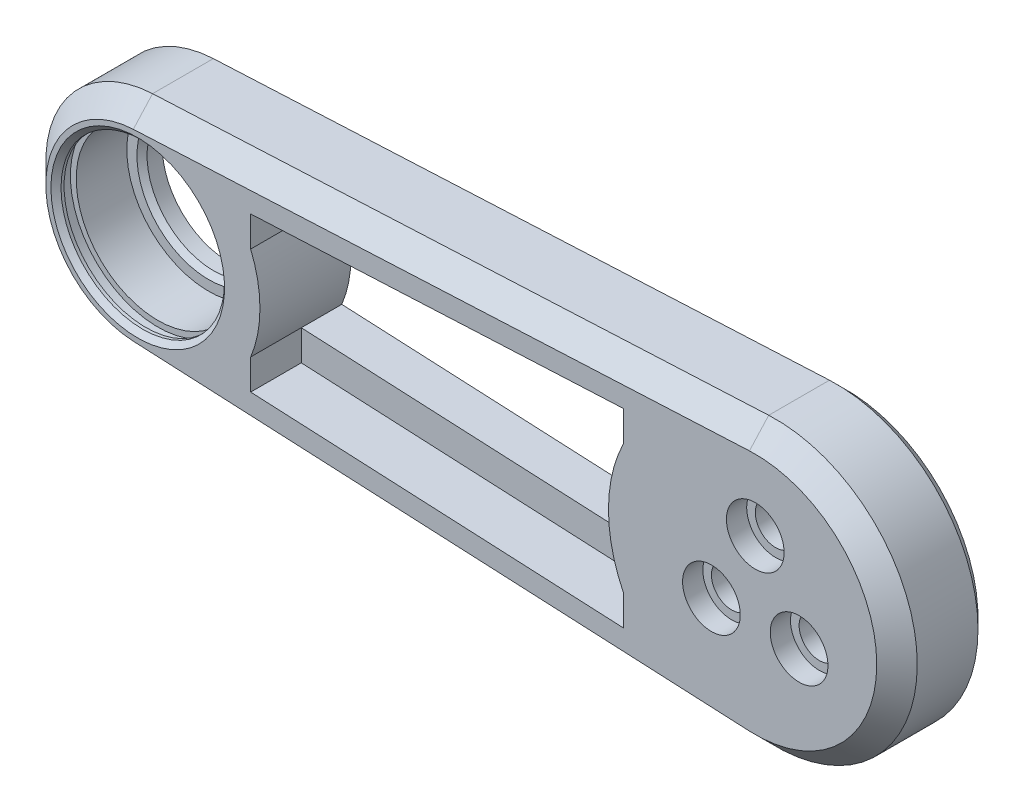
ISO-10303-21;
HEADER;
FILE_DESCRIPTION(('STEP AP214'),'2;1');
FILE_NAME('part.step','',(''),(''),'','','');
FILE_SCHEMA(('AUTOMOTIVE_DESIGN { 1 0 10303 214 1 1 1 1 }'));
ENDSEC;
DATA;
#1=APPLICATION_CONTEXT('core data for automotive mechanical design processes');
#2=APPLICATION_PROTOCOL_DEFINITION('international standard','automotive_design',2000,#1);
#3=PRODUCT_CONTEXT('',#1,'mechanical');
#4=PRODUCT('Part','Part','',(#3));
#5=PRODUCT_RELATED_PRODUCT_CATEGORY('part','',(#4));
#6=PRODUCT_DEFINITION_FORMATION('','',#4);
#7=PRODUCT_DEFINITION_CONTEXT('part definition',#1,'design');
#8=PRODUCT_DEFINITION('design','',#6,#7);
#9=PRODUCT_DEFINITION_SHAPE('','',#8);
#10=(LENGTH_UNIT() NAMED_UNIT(*) SI_UNIT(.MILLI.,.METRE.));
#11=(NAMED_UNIT(*) PLANE_ANGLE_UNIT() SI_UNIT($,.RADIAN.));
#12=(NAMED_UNIT(*) SI_UNIT($,.STERADIAN.) SOLID_ANGLE_UNIT());
#13=UNCERTAINTY_MEASURE_WITH_UNIT(LENGTH_MEASURE(1.E-05),#10,'distance_accuracy_value','');
#14=(GEOMETRIC_REPRESENTATION_CONTEXT(3) GLOBAL_UNCERTAINTY_ASSIGNED_CONTEXT((#13)) GLOBAL_UNIT_ASSIGNED_CONTEXT((#10,
#11,#12)) REPRESENTATION_CONTEXT('',''));
#15=CARTESIAN_POINT('',(0.,0.,0.));
#16=DIRECTION('',(0.,0.,1.));
#17=DIRECTION('',(1.,0.,0.));
#18=AXIS2_PLACEMENT_3D('',#15,#16,#17);
#19=CARTESIAN_POINT('',(56.6698729810778,-2.5,-0.656854249492387));
#20=DIRECTION('',(0.,0.,1.));
#21=DIRECTION('',(-1.,0.,0.));
#22=AXIS2_PLACEMENT_3D('',#19,#20,#21);
#23=CYLINDRICAL_SURFACE('',#22,2.);
#24=CARTESIAN_POINT('',(56.6698729810778,-2.5,4.));
#25=DIRECTION('',(0.,0.,1.));
#26=DIRECTION('',(1.,0.,0.));
#27=AXIS2_PLACEMENT_3D('',#24,#25,#26);
#28=CIRCLE('',#27,2.);
#29=CARTESIAN_POINT('',(58.6698729810778,-2.5,4.));
#30=VERTEX_POINT('',#29);
#31=EDGE_CURVE('E196',#30,#30,#28,.F.);
#32=ORIENTED_EDGE('',*,*,#31,.T.);
#33=EDGE_LOOP('',(#32));
#34=FACE_BOUND('',#33,.T.);
#35=CARTESIAN_POINT('',(56.6698729810778,-2.5,6.));
#36=DIRECTION('',(0.,0.,-1.));
#37=DIRECTION('',(-1.,0.,0.));
#38=AXIS2_PLACEMENT_3D('',#35,#36,#37);
#39=CIRCLE('',#38,2.);
#40=CARTESIAN_POINT('',(54.6698729810778,-2.5,6.));
#41=VERTEX_POINT('',#40);
#42=EDGE_CURVE('E944',#41,#41,#39,.T.);
#43=ORIENTED_EDGE('',*,*,#42,.F.);
#44=EDGE_LOOP('',(#43));
#45=FACE_BOUND('',#44,.T.);
#46=ADVANCED_FACE('F50',(#34,#45),#23,.F.);
#47=CARTESIAN_POINT('',(65.3301270189222,-2.5,-0.656854249492387));
#48=DIRECTION('',(0.,0.,1.));
#49=DIRECTION('',(-1.,0.,0.));
#50=AXIS2_PLACEMENT_3D('',#47,#48,#49);
#51=CYLINDRICAL_SURFACE('',#50,2.);
#52=CARTESIAN_POINT('',(65.3301270189222,-2.5,4.));
#53=DIRECTION('',(0.,0.,1.));
#54=DIRECTION('',(1.,0.,0.));
#55=AXIS2_PLACEMENT_3D('',#52,#53,#54);
#56=CIRCLE('',#55,2.);
#57=CARTESIAN_POINT('',(67.3301270189222,-2.5,4.));
#58=VERTEX_POINT('',#57);
#59=EDGE_CURVE('E932',#58,#58,#56,.F.);
#60=ORIENTED_EDGE('',*,*,#59,.T.);
#61=EDGE_LOOP('',(#60));
#62=FACE_BOUND('',#61,.T.);
#63=CARTESIAN_POINT('',(65.3301270189222,-2.5,6.));
#64=DIRECTION('',(0.,0.,-1.));
#65=DIRECTION('',(-1.,0.,0.));
#66=AXIS2_PLACEMENT_3D('',#63,#64,#65);
#67=CIRCLE('',#66,2.00000000000001);
#68=CARTESIAN_POINT('',(63.3301270189222,-2.5,6.));
#69=VERTEX_POINT('',#68);
#70=EDGE_CURVE('E937',#69,#69,#67,.T.);
#71=ORIENTED_EDGE('',*,*,#70,.F.);
#72=EDGE_LOOP('',(#71));
#73=FACE_BOUND('',#72,.T.);
#74=ADVANCED_FACE('F402',(#62,#73),#51,.F.);
#75=CARTESIAN_POINT('',(61.,5.,-0.656854249492387));
#76=DIRECTION('',(0.,0.,1.));
#77=DIRECTION('',(-1.,0.,0.));
#78=AXIS2_PLACEMENT_3D('',#75,#76,#77);
#79=CYLINDRICAL_SURFACE('',#78,2.);
#80=CARTESIAN_POINT('',(61.,5.,4.));
#81=DIRECTION('',(0.,0.,1.));
#82=DIRECTION('',(1.,0.,0.));
#83=AXIS2_PLACEMENT_3D('',#80,#81,#82);
#84=CIRCLE('',#83,2.);
#85=CARTESIAN_POINT('',(63.,5.,4.));
#86=VERTEX_POINT('',#85);
#87=EDGE_CURVE('E194',#86,#86,#84,.F.);
#88=ORIENTED_EDGE('',*,*,#87,.T.);
#89=EDGE_LOOP('',(#88));
#90=FACE_BOUND('',#89,.T.);
#91=CARTESIAN_POINT('',(61.,5.,6.));
#92=DIRECTION('',(0.,0.,-1.));
#93=DIRECTION('',(-1.,0.,0.));
#94=AXIS2_PLACEMENT_3D('',#91,#92,#93);
#95=CIRCLE('',#94,2.);
#96=CARTESIAN_POINT('',(59.,5.,6.));
#97=VERTEX_POINT('',#96);
#98=EDGE_CURVE('E931',#97,#97,#95,.T.);
#99=ORIENTED_EDGE('',*,*,#98,.F.);
#100=EDGE_LOOP('',(#99));
#101=FACE_BOUND('',#100,.T.);
#102=ADVANCED_FACE('F410',(#90,#101),#79,.F.);
#103=CARTESIAN_POINT('',(-0.195399590163935,4.07031251873413,46.9725685445366));
#104=DIRECTION('',(-0.0479508196721314,0.998849697848866,0.));
#105=DIRECTION('',(-0.998849697848866,-0.0479508196721314,0.));
#106=AXIS2_PLACEMENT_3D('',#103,#104,#105);
#107=PLANE('',#106);
#108=DIRECTION('',(0.998849697848866,0.0479508196721314,0.));
#109=VECTOR('',#108,1.);
#110=CARTESIAN_POINT('',(-0.195399590163935,4.07031251873413,-0.999999999999999));
#111=LINE('',#110,#109);
#112=CARTESIAN_POINT('',(11.1581431556465,4.61535115869832,-0.999999999999999));
#113=VERTEX_POINT('',#112);
#114=CARTESIAN_POINT('',(47.9805261888024,6.38304799289025,-0.999999999999999));
#115=VERTEX_POINT('',#114);
#116=EDGE_CURVE('E193',#113,#115,#111,.T.);
#117=ORIENTED_EDGE('',*,*,#116,.T.);
#118=DIRECTION('',(0.,0.,-1.));
#119=VECTOR('',#118,1.);
#120=CARTESIAN_POINT('',(47.9805261888024,6.38304799289025,46.9725685445366));
#121=LINE('',#120,#119);
#122=CARTESIAN_POINT('',(47.9805261888024,6.38304799289026,3.));
#123=VERTEX_POINT('',#122);
#124=EDGE_CURVE('E180',#123,#115,#121,.T.);
#125=ORIENTED_EDGE('',*,*,#124,.F.);
#126=DIRECTION('',(-0.998849697848866,-0.0479508196721314,0.));
#127=VECTOR('',#126,1.);
#128=CARTESIAN_POINT('',(-0.195399590163935,4.07031251873413,3.));
#129=LINE('',#128,#127);
#130=CARTESIAN_POINT('',(11.1581431556465,4.61535115869832,3.));
#131=VERTEX_POINT('',#130);
#132=EDGE_CURVE('E237',#123,#131,#129,.T.);
#133=ORIENTED_EDGE('',*,*,#132,.T.);
#134=DIRECTION('',(0.,0.,-1.));
#135=VECTOR('',#134,1.);
#136=CARTESIAN_POINT('',(11.1581431556465,4.61535115869833,46.9725685445366));
#137=LINE('',#136,#135);
#138=EDGE_CURVE('E273',#131,#113,#137,.T.);
#139=ORIENTED_EDGE('',*,*,#138,.T.);
#140=EDGE_LOOP('',(#117,#125,#133,#139));
#141=FACE_BOUND('',#140,.T.);
#142=ADVANCED_FACE('F498',(#141),#107,.F.);
#143=CARTESIAN_POINT('',(-0.195399590163936,-4.07031251873413,46.9725685445366));
#144=DIRECTION('',(-0.0479508196721316,-0.998849697848866,0.));
#145=DIRECTION('',(0.998849697848866,-0.0479508196721316,0.));
#146=AXIS2_PLACEMENT_3D('',#143,#144,#145);
#147=PLANE('',#146);
#148=DIRECTION('',(-0.998849697848866,0.0479508196721316,0.));
#149=VECTOR('',#148,1.);
#150=CARTESIAN_POINT('',(-0.195399590163936,-4.07031251873413,-0.999999999999999));
#151=LINE('',#150,#149);
#152=CARTESIAN_POINT('',(47.9805261888024,-6.38304799289026,-0.999999999999999));
#153=VERTEX_POINT('',#152);
#154=CARTESIAN_POINT('',(11.1581431556465,-4.61535115869833,-0.999999999999999));
#155=VERTEX_POINT('',#154);
#156=EDGE_CURVE('E181',#153,#155,#151,.T.);
#157=ORIENTED_EDGE('',*,*,#156,.T.);
#158=DIRECTION('',(0.,0.,-1.));
#159=VECTOR('',#158,1.);
#160=CARTESIAN_POINT('',(11.1581431556465,-4.61535115869833,46.9725685445366));
#161=LINE('',#160,#159);
#162=CARTESIAN_POINT('',(11.1581431556465,-4.61535115869833,3.));
#163=VERTEX_POINT('',#162);
#164=EDGE_CURVE('E276',#163,#155,#161,.T.);
#165=ORIENTED_EDGE('',*,*,#164,.F.);
#166=DIRECTION('',(0.998849697848866,-0.0479508196721316,0.));
#167=VECTOR('',#166,1.);
#168=CARTESIAN_POINT('',(-0.195399590163936,-4.07031251873413,3.));
#169=LINE('',#168,#167);
#170=CARTESIAN_POINT('',(47.9805261888024,-6.38304799289027,3.));
#171=VERTEX_POINT('',#170);
#172=EDGE_CURVE('E183',#163,#171,#169,.T.);
#173=ORIENTED_EDGE('',*,*,#172,.T.);
#174=DIRECTION('',(0.,0.,-1.));
#175=VECTOR('',#174,1.);
#176=CARTESIAN_POINT('',(47.9805261888024,-6.38304799289027,46.9725685445366));
#177=LINE('',#176,#175);
#178=EDGE_CURVE('E172',#171,#153,#177,.T.);
#179=ORIENTED_EDGE('',*,*,#178,.T.);
#180=EDGE_LOOP('',(#157,#165,#173,#179));
#181=FACE_BOUND('',#180,.T.);
#182=ADVANCED_FACE('F182',(#181),#147,.F.);
#183=CARTESIAN_POINT('',(61.,0.,5.));
#184=DIRECTION('',(0.,0.,-1.));
#185=DIRECTION('',(1.,0.,0.));
#186=AXIS2_PLACEMENT_3D('',#183,#184,#185);
#187=CYLINDRICAL_SURFACE('',#186,9.00000000000001);
#188=CARTESIAN_POINT('',(61.,0.,4.));
#189=DIRECTION('',(0.,0.,1.));
#190=DIRECTION('',(1.,0.,0.));
#191=AXIS2_PLACEMENT_3D('',#188,#189,#190);
#192=CIRCLE('',#191,9.00000000000001);
#193=CARTESIAN_POINT('',(70.,0.,4.));
#194=VERTEX_POINT('',#193);
#195=EDGE_CURVE('E957',#194,#194,#192,.T.);
#196=ORIENTED_EDGE('',*,*,#195,.T.);
#197=EDGE_LOOP('',(#196));
#198=FACE_BOUND('',#197,.T.);
#199=CARTESIAN_POINT('',(61.,0.,-1.));
#200=DIRECTION('',(0.,0.,1.));
#201=DIRECTION('',(1.,0.,0.));
#202=AXIS2_PLACEMENT_3D('',#199,#200,#201);
#203=CIRCLE('',#202,9.00000000000001);
#204=CARTESIAN_POINT('',(70.,0.,-1.));
#205=VERTEX_POINT('',#204);
#206=EDGE_CURVE('E212',#205,#205,#203,.F.);
#207=ORIENTED_EDGE('',*,*,#206,.T.);
#208=EDGE_LOOP('',(#207));
#209=FACE_BOUND('',#208,.T.);
#210=ADVANCED_FACE('F417',(#198,#209),#187,.F.);
#211=CARTESIAN_POINT('',(0.,0.,1.));
#212=DIRECTION('',(0.,0.,-1.));
#213=DIRECTION('',(1.,0.,0.));
#214=AXIS2_PLACEMENT_3D('',#211,#212,#213);
#215=CYLINDRICAL_SURFACE('',#214,6.575);
#216=CARTESIAN_POINT('',(0.,0.,0.500000000000003));
#217=DIRECTION('',(0.,0.,1.));
#218=DIRECTION('',(1.,0.,0.));
#219=AXIS2_PLACEMENT_3D('',#216,#217,#218);
#220=CIRCLE('',#219,6.575);
#221=CARTESIAN_POINT('',(6.575,0.,0.500000000000003));
#222=VERTEX_POINT('',#221);
#223=EDGE_CURVE('E307',#222,#222,#220,.F.);
#224=ORIENTED_EDGE('',*,*,#223,.F.);
#225=EDGE_LOOP('',(#224));
#226=FACE_BOUND('',#225,.T.);
#227=CARTESIAN_POINT('',(0.,0.,-1.));
#228=DIRECTION('',(0.,0.,1.));
#229=DIRECTION('',(1.,0.,0.));
#230=AXIS2_PLACEMENT_3D('',#227,#228,#229);
#231=CIRCLE('',#230,6.575);
#232=CARTESIAN_POINT('',(6.575,0.,-1.));
#233=VERTEX_POINT('',#232);
#234=EDGE_CURVE('E211',#233,#233,#231,.F.);
#235=ORIENTED_EDGE('',*,*,#234,.T.);
#236=EDGE_LOOP('',(#235));
#237=FACE_BOUND('',#236,.T.);
#238=ADVANCED_FACE('F414',(#226,#237),#215,.F.);
#239=CARTESIAN_POINT('',(-0.531055327868853,11.0622604036762,0.));
#240=DIRECTION('',(-0.0339063497536172,0.706293394735065,-0.707106781186549));
#241=DIRECTION('',(-0.998849697848866,-0.0479508196721312,0.));
#242=AXIS2_PLACEMENT_3D('',#239,#240,#241);
#243=PLANE('',#242);
#244=DIRECTION('',(-0.0339063497536173,0.706293394735069,0.707106781186546));
#245=VECTOR('',#244,1.);
#246=CARTESIAN_POINT('',(-0.43515368852459,9.06456100797846,-2.));
#247=LINE('',#246,#245);
#248=CARTESIAN_POINT('',(-0.483104508196722,10.0634107058273,-1.));
#249=VERTEX_POINT('',#248);
#250=CARTESIAN_POINT('',(-0.531055327868852,11.0622604036762,0.));
#251=VERTEX_POINT('',#250);
#252=EDGE_CURVE('E346',#249,#251,#247,.T.);
#253=ORIENTED_EDGE('',*,*,#252,.T.);
#254=DIRECTION('',(0.998849697848866,0.0479508196721312,0.));
#255=VECTOR('',#254,1.);
#256=CARTESIAN_POINT('',(60.3286885245902,13.9838957698841,0.));
#257=LINE('',#256,#255);
#258=CARTESIAN_POINT('',(60.3286885245902,13.9838957698841,0.));
#259=VERTEX_POINT('',#258);
#260=EDGE_CURVE('E339',#251,#259,#257,.T.);
#261=ORIENTED_EDGE('',*,*,#260,.T.);
#262=DIRECTION('',(0.0339063497536167,-0.706293394735069,-0.707106781186546));
#263=VECTOR('',#262,1.);
#264=CARTESIAN_POINT('',(60.3286885245902,13.9838957698841,0.));
#265=LINE('',#264,#263);
#266=CARTESIAN_POINT('',(60.3766393442623,12.9850460720353,-1.));
#267=VERTEX_POINT('',#266);
#268=EDGE_CURVE('E358',#259,#267,#265,.T.);
#269=ORIENTED_EDGE('',*,*,#268,.T.);
#270=DIRECTION('',(0.998849697848866,0.0479508196721312,0.));
#271=VECTOR('',#270,1.);
#272=CARTESIAN_POINT('',(-0.483104508196722,10.0634107058273,-1.));
#273=LINE('',#272,#271);
#274=EDGE_CURVE('E208',#249,#267,#273,.T.);
#275=ORIENTED_EDGE('',*,*,#274,.F.);
#276=EDGE_LOOP('',(#253,#261,#269,#275));
#277=FACE_BOUND('',#276,.T.);
#278=ADVANCED_FACE('F47',(#277),#243,.T.);
#279=CARTESIAN_POINT('',(0.,0.,-2.));
#280=DIRECTION('',(0.,0.,1.));
#281=DIRECTION('',(-1.,0.,0.));
#282=AXIS2_PLACEMENT_3D('',#279,#280,#281);
#283=CONICAL_SURFACE('',#282,9.075,0.785398163397451);
#284=DIRECTION('',(-0.0339063497536173,-0.706293394735069,0.707106781186546));
#285=VECTOR('',#284,1.);
#286=CARTESIAN_POINT('',(-0.43515368852459,-9.06456100797846,-2.));
#287=LINE('',#286,#285);
#288=CARTESIAN_POINT('',(-0.483104508196722,-10.0634107058273,-1.));
#289=VERTEX_POINT('',#288);
#290=CARTESIAN_POINT('',(-0.531055327868852,-11.0622604036762,0.));
#291=VERTEX_POINT('',#290);
#292=EDGE_CURVE('E354',#289,#291,#287,.T.);
#293=ORIENTED_EDGE('',*,*,#292,.T.);
#294=CARTESIAN_POINT('',(0.,0.,0.));
#295=DIRECTION('',(0.,0.,1.));
#296=DIRECTION('',(1.,0.,0.));
#297=AXIS2_PLACEMENT_3D('',#294,#295,#296);
#298=CIRCLE('',#297,11.075);
#299=EDGE_CURVE('E327',#291,#251,#298,.F.);
#300=ORIENTED_EDGE('',*,*,#299,.T.);
#301=ORIENTED_EDGE('',*,*,#252,.F.);
#302=CARTESIAN_POINT('',(0.,0.,-1.));
#303=DIRECTION('',(0.,0.,1.));
#304=DIRECTION('',(1.,0.,0.));
#305=AXIS2_PLACEMENT_3D('',#302,#303,#304);
#306=CIRCLE('',#305,10.075);
#307=EDGE_CURVE('E206',#289,#249,#306,.F.);
#308=ORIENTED_EDGE('',*,*,#307,.F.);
#309=EDGE_LOOP('',(#293,#300,#301,#308));
#310=FACE_BOUND('',#309,.T.);
#311=ADVANCED_FACE('F368',(#310),#283,.T.);
#312=CARTESIAN_POINT('',(61.,0.,-2.));
#313=DIRECTION('',(0.,0.,1.));
#314=DIRECTION('',(-1.,0.,0.));
#315=AXIS2_PLACEMENT_3D('',#312,#313,#314);
#316=CONICAL_SURFACE('',#315,12.,0.785398163397451);
#317=ORIENTED_EDGE('',*,*,#268,.F.);
#318=CARTESIAN_POINT('',(61.,0.,0.));
#319=DIRECTION('',(0.,0.,1.));
#320=DIRECTION('',(1.,0.,0.));
#321=AXIS2_PLACEMENT_3D('',#318,#319,#320);
#322=CIRCLE('',#321,14.);
#323=CARTESIAN_POINT('',(60.3286885245902,-13.9838957698841,0.));
#324=VERTEX_POINT('',#323);
#325=EDGE_CURVE('E331',#259,#324,#322,.F.);
#326=ORIENTED_EDGE('',*,*,#325,.T.);
#327=DIRECTION('',(0.0339063497536167,0.706293394735069,-0.707106781186546));
#328=VECTOR('',#327,1.);
#329=CARTESIAN_POINT('',(60.3286885245902,-13.9838957698842,0.));
#330=LINE('',#329,#328);
#331=CARTESIAN_POINT('',(60.3766393442623,-12.9850460720353,-1.00000000000001));
#332=VERTEX_POINT('',#331);
#333=EDGE_CURVE('E284',#324,#332,#330,.T.);
#334=ORIENTED_EDGE('',*,*,#333,.T.);
#335=CARTESIAN_POINT('',(61.,0.,-1.));
#336=DIRECTION('',(0.,0.,1.));
#337=DIRECTION('',(1.,0.,0.));
#338=AXIS2_PLACEMENT_3D('',#335,#336,#337);
#339=CIRCLE('',#338,13.);
#340=EDGE_CURVE('E204',#267,#332,#339,.F.);
#341=ORIENTED_EDGE('',*,*,#340,.F.);
#342=EDGE_LOOP('',(#317,#326,#334,#341));
#343=FACE_BOUND('',#342,.T.);
#344=ADVANCED_FACE('F383',(#343),#316,.T.);
#345=CARTESIAN_POINT('',(-0.43515368852459,-9.06456100797846,-2.));
#346=DIRECTION('',(0.0339063497536172,0.706293394735065,0.707106781186549));
#347=DIRECTION('',(0.998849697848866,-0.0479508196721312,0.));
#348=AXIS2_PLACEMENT_3D('',#345,#346,#347);
#349=PLANE('',#348);
#350=ORIENTED_EDGE('',*,*,#333,.F.);
#351=DIRECTION('',(-0.998849697848866,0.0479508196721312,0.));
#352=VECTOR('',#351,1.);
#353=CARTESIAN_POINT('',(-0.531055327868853,-11.0622604036762,0.));
#354=LINE('',#353,#352);
#355=EDGE_CURVE('E325',#324,#291,#354,.T.);
#356=ORIENTED_EDGE('',*,*,#355,.T.);
#357=ORIENTED_EDGE('',*,*,#292,.F.);
#358=DIRECTION('',(0.998849697848866,-0.0479508196721312,0.));
#359=VECTOR('',#358,1.);
#360=CARTESIAN_POINT('',(-0.483104508196722,-10.0634107058273,-1.));
#361=LINE('',#360,#359);
#362=EDGE_CURVE('E65',#332,#289,#361,.F.);
#363=ORIENTED_EDGE('',*,*,#362,.F.);
#364=EDGE_LOOP('',(#350,#356,#357,#363));
#365=FACE_BOUND('',#364,.T.);
#366=ADVANCED_FACE('F473',(#365),#349,.F.);
#367=CARTESIAN_POINT('',(0.,0.,46.9725685445366));
#368=DIRECTION('',(0.,0.,-1.));
#369=DIRECTION('',(1.,0.,0.));
#370=AXIS2_PLACEMENT_3D('',#367,#368,#369);
#371=CYLINDRICAL_SURFACE('',#370,12.075);
#372=ORIENTED_EDGE('',*,*,#138,.F.);
#373=CARTESIAN_POINT('',(11.1581431556465,4.61535115869832,8.));
#374=VERTEX_POINT('',#373);
#375=EDGE_CURVE('E278',#374,#131,#137,.T.);
#376=ORIENTED_EDGE('',*,*,#375,.F.);
#377=CARTESIAN_POINT('',(0.,0.,8.));
#378=DIRECTION('',(0.,0.,-1.));
#379=DIRECTION('',(-1.,0.,0.));
#380=AXIS2_PLACEMENT_3D('',#377,#378,#379);
#381=CIRCLE('',#380,12.075);
#382=CARTESIAN_POINT('',(11.1581431556465,-4.61535115869833,8.));
#383=VERTEX_POINT('',#382);
#384=EDGE_CURVE('E275',#383,#374,#381,.F.);
#385=ORIENTED_EDGE('',*,*,#384,.F.);
#386=EDGE_CURVE('E190',#383,#163,#161,.T.);
#387=ORIENTED_EDGE('',*,*,#386,.T.);
#388=ORIENTED_EDGE('',*,*,#164,.T.);
#389=CARTESIAN_POINT('',(0.,0.,-0.999999999999999));
#390=DIRECTION('',(0.,0.,1.));
#391=DIRECTION('',(1.,0.,0.));
#392=AXIS2_PLACEMENT_3D('',#389,#390,#391);
#393=CIRCLE('',#392,12.075);
#394=EDGE_CURVE('E192',#113,#155,#393,.F.);
#395=ORIENTED_EDGE('',*,*,#394,.F.);
#396=EDGE_LOOP('',(#372,#376,#385,#387,#388,#395));
#397=FACE_BOUND('',#396,.T.);
#398=ADVANCED_FACE('F475',(#397),#371,.T.);
#399=CARTESIAN_POINT('',(61.,0.,46.9725685445366));
#400=DIRECTION('',(0.,0.,-1.));
#401=DIRECTION('',(1.,0.,0.));
#402=AXIS2_PLACEMENT_3D('',#399,#400,#401);
#403=CYLINDRICAL_SURFACE('',#402,14.5);
#404=ORIENTED_EDGE('',*,*,#178,.F.);
#405=CARTESIAN_POINT('',(47.9805261888024,-6.38304799289027,8.));
#406=VERTEX_POINT('',#405);
#407=EDGE_CURVE('E186',#406,#171,#177,.T.);
#408=ORIENTED_EDGE('',*,*,#407,.F.);
#409=CARTESIAN_POINT('',(61.,0.,8.));
#410=DIRECTION('',(0.,0.,-1.));
#411=DIRECTION('',(-1.,0.,0.));
#412=AXIS2_PLACEMENT_3D('',#409,#410,#411);
#413=CIRCLE('',#412,14.5);
#414=CARTESIAN_POINT('',(47.9805261888024,6.38304799289026,8.));
#415=VERTEX_POINT('',#414);
#416=EDGE_CURVE('E253',#415,#406,#413,.F.);
#417=ORIENTED_EDGE('',*,*,#416,.F.);
#418=EDGE_CURVE('E282',#415,#123,#121,.T.);
#419=ORIENTED_EDGE('',*,*,#418,.T.);
#420=ORIENTED_EDGE('',*,*,#124,.T.);
#421=CARTESIAN_POINT('',(61.,0.,-0.999999999999999));
#422=DIRECTION('',(0.,0.,1.));
#423=DIRECTION('',(1.,0.,0.));
#424=AXIS2_PLACEMENT_3D('',#421,#422,#423);
#425=CIRCLE('',#424,14.5);
#426=EDGE_CURVE('E11',#153,#115,#425,.F.);
#427=ORIENTED_EDGE('',*,*,#426,.F.);
#428=EDGE_LOOP('',(#404,#408,#417,#419,#420,#427));
#429=FACE_BOUND('',#428,.T.);
#430=ADVANCED_FACE('F171',(#429),#403,.T.);
#431=CARTESIAN_POINT('',(0.,0.,5.));
#432=DIRECTION('',(0.,0.,-1.));
#433=DIRECTION('',(1.,0.,0.));
#434=AXIS2_PLACEMENT_3D('',#431,#432,#433);
#435=CYLINDRICAL_SURFACE('',#434,8.075);
#436=CARTESIAN_POINT('',(0.,0.,7.2));
#437=DIRECTION('',(0.,0.,1.));
#438=DIRECTION('',(1.,0.,0.));
#439=AXIS2_PLACEMENT_3D('',#436,#437,#438);
#440=CIRCLE('',#439,8.075);
#441=CARTESIAN_POINT('',(8.075,0.,7.2));
#442=VERTEX_POINT('',#441);
#443=EDGE_CURVE('E226',#442,#442,#440,.T.);
#444=ORIENTED_EDGE('',*,*,#443,.F.);
#445=EDGE_LOOP('',(#444));
#446=FACE_BOUND('',#445,.T.);
#447=CARTESIAN_POINT('',(0.,0.,7.5));
#448=DIRECTION('',(0.,0.,-1.));
#449=DIRECTION('',(-1.,0.,0.));
#450=AXIS2_PLACEMENT_3D('',#447,#448,#449);
#451=CIRCLE('',#450,8.075);
#452=CARTESIAN_POINT('',(-8.075,0.,7.5));
#453=VERTEX_POINT('',#452);
#454=EDGE_CURVE('E302',#453,#453,#451,.T.);
#455=ORIENTED_EDGE('',*,*,#454,.F.);
#456=EDGE_LOOP('',(#455));
#457=FACE_BOUND('',#456,.T.);
#458=ADVANCED_FACE('F434',(#446,#457),#435,.F.);
#459=CARTESIAN_POINT('',(0.,0.,6.));
#460=DIRECTION('',(0.,0.,1.));
#461=DIRECTION('',(1.,0.,0.));
#462=AXIS2_PLACEMENT_3D('',#459,#460,#461);
#463=CIRCLE('',#462,8.075);
#464=CARTESIAN_POINT('',(8.075,0.,6.));
#465=VERTEX_POINT('',#464);
#466=EDGE_CURVE('E224',#465,#465,#463,.T.);
#467=ORIENTED_EDGE('',*,*,#466,.T.);
#468=EDGE_LOOP('',(#467));
#469=FACE_BOUND('',#468,.T.);
#470=CARTESIAN_POINT('',(0.,0.,1.));
#471=DIRECTION('',(0.,0.,1.));
#472=DIRECTION('',(1.,0.,0.));
#473=AXIS2_PLACEMENT_3D('',#470,#471,#472);
#474=CIRCLE('',#473,8.075);
#475=CARTESIAN_POINT('',(8.075,0.,1.));
#476=VERTEX_POINT('',#475);
#477=EDGE_CURVE('E288',#476,#476,#474,.F.);
#478=ORIENTED_EDGE('',*,*,#477,.T.);
#479=EDGE_LOOP('',(#478));
#480=FACE_BOUND('',#479,.T.);
#481=ADVANCED_FACE('F431',(#469,#480),#435,.F.);
#482=CARTESIAN_POINT('',(-0.531055327868853,-11.0622604036762,5.));
#483=DIRECTION('',(-0.0479508196721312,-0.998849697848866,0.));
#484=DIRECTION('',(0.998849697848866,-0.0479508196721312,0.));
#485=AXIS2_PLACEMENT_3D('',#482,#483,#484);
#486=PLANE('',#485);
#487=DIRECTION('',(0.,0.,-1.));
#488=VECTOR('',#487,1.);
#489=CARTESIAN_POINT('',(-0.531055327868852,-11.0622604036762,5.));
#490=LINE('',#489,#488);
#491=CARTESIAN_POINT('',(-0.531055327868852,-11.0622604036762,6.));
#492=VERTEX_POINT('',#491);
#493=EDGE_CURVE('E287',#492,#291,#490,.T.);
#494=ORIENTED_EDGE('',*,*,#493,.T.);
#495=ORIENTED_EDGE('',*,*,#355,.F.);
#496=DIRECTION('',(0.,0.,-1.));
#497=VECTOR('',#496,1.);
#498=CARTESIAN_POINT('',(60.3286885245902,-13.9838957698841,5.));
#499=LINE('',#498,#497);
#500=CARTESIAN_POINT('',(60.3286885245902,-13.9838957698841,6.));
#501=VERTEX_POINT('',#500);
#502=EDGE_CURVE('E291',#501,#324,#499,.T.);
#503=ORIENTED_EDGE('',*,*,#502,.F.);
#504=DIRECTION('',(0.998849697848866,-0.0479508196721312,0.));
#505=VECTOR('',#504,1.);
#506=CARTESIAN_POINT('',(-0.531055327868853,-11.0622604036762,6.));
#507=LINE('',#506,#505);
#508=EDGE_CURVE('E324',#492,#501,#507,.T.);
#509=ORIENTED_EDGE('',*,*,#508,.F.);
#510=EDGE_LOOP('',(#494,#495,#503,#509));
#511=FACE_BOUND('',#510,.T.);
#512=ADVANCED_FACE('F432',(#511),#486,.T.);
#513=CARTESIAN_POINT('',(0.,0.,5.));
#514=DIRECTION('',(0.,0.,-1.));
#515=DIRECTION('',(1.,0.,0.));
#516=AXIS2_PLACEMENT_3D('',#513,#514,#515);
#517=CYLINDRICAL_SURFACE('',#516,11.075);
#518=DIRECTION('',(0.,0.,-1.));
#519=VECTOR('',#518,1.);
#520=CARTESIAN_POINT('',(-0.531055327868852,11.0622604036762,5.));
#521=LINE('',#520,#519);
#522=CARTESIAN_POINT('',(-0.531055327868852,11.0622604036762,6.));
#523=VERTEX_POINT('',#522);
#524=EDGE_CURVE('E289',#523,#251,#521,.T.);
#525=ORIENTED_EDGE('',*,*,#524,.T.);
#526=ORIENTED_EDGE('',*,*,#299,.F.);
#527=ORIENTED_EDGE('',*,*,#493,.F.);
#528=CARTESIAN_POINT('',(0.,0.,6.));
#529=DIRECTION('',(0.,0.,-1.));
#530=DIRECTION('',(-1.,0.,0.));
#531=AXIS2_PLACEMENT_3D('',#528,#529,#530);
#532=CIRCLE('',#531,11.075);
#533=EDGE_CURVE('E332',#523,#492,#532,.F.);
#534=ORIENTED_EDGE('',*,*,#533,.F.);
#535=EDGE_LOOP('',(#525,#526,#527,#534));
#536=FACE_BOUND('',#535,.T.);
#537=ADVANCED_FACE('F440',(#536),#517,.T.);
#538=CARTESIAN_POINT('',(-0.531055327868853,11.0622604036762,5.));
#539=DIRECTION('',(0.0479508196721312,-0.998849697848866,0.));
#540=DIRECTION('',(0.998849697848866,0.0479508196721312,0.));
#541=AXIS2_PLACEMENT_3D('',#538,#539,#540);
#542=PLANE('',#541);
#543=DIRECTION('',(0.,0.,-1.));
#544=VECTOR('',#543,1.);
#545=CARTESIAN_POINT('',(60.3286885245902,13.9838957698841,5.));
#546=LINE('',#545,#544);
#547=CARTESIAN_POINT('',(60.3286885245902,13.9838957698841,6.));
#548=VERTEX_POINT('',#547);
#549=EDGE_CURVE('E292',#548,#259,#546,.T.);
#550=ORIENTED_EDGE('',*,*,#549,.T.);
#551=ORIENTED_EDGE('',*,*,#260,.F.);
#552=ORIENTED_EDGE('',*,*,#524,.F.);
#553=DIRECTION('',(-0.998849697848866,-0.0479508196721312,0.));
#554=VECTOR('',#553,1.);
#555=CARTESIAN_POINT('',(-0.531055327868852,11.0622604036762,6.));
#556=LINE('',#555,#554);
#557=EDGE_CURVE('E54',#548,#523,#556,.T.);
#558=ORIENTED_EDGE('',*,*,#557,.F.);
#559=EDGE_LOOP('',(#550,#551,#552,#558));
#560=FACE_BOUND('',#559,.T.);
#561=ADVANCED_FACE('F373',(#560),#542,.F.);
#562=CARTESIAN_POINT('',(61.,0.,5.));
#563=DIRECTION('',(0.,0.,-1.));
#564=DIRECTION('',(1.,0.,0.));
#565=AXIS2_PLACEMENT_3D('',#562,#563,#564);
#566=CYLINDRICAL_SURFACE('',#565,14.);
#567=ORIENTED_EDGE('',*,*,#502,.T.);
#568=ORIENTED_EDGE('',*,*,#325,.F.);
#569=ORIENTED_EDGE('',*,*,#549,.F.);
#570=CARTESIAN_POINT('',(61.,0.,6.));
#571=DIRECTION('',(0.,0.,-1.));
#572=DIRECTION('',(-1.,0.,0.));
#573=AXIS2_PLACEMENT_3D('',#570,#571,#572);
#574=CIRCLE('',#573,14.);
#575=EDGE_CURVE('E340',#501,#548,#574,.F.);
#576=ORIENTED_EDGE('',*,*,#575,.F.);
#577=EDGE_LOOP('',(#567,#568,#569,#576));
#578=FACE_BOUND('',#577,.T.);
#579=ADVANCED_FACE('F379',(#578),#566,.T.);
#580=CARTESIAN_POINT('',(0.,0.,8.));
#581=DIRECTION('',(0.,0.,1.));
#582=DIRECTION('',(-1.,0.,0.));
#583=AXIS2_PLACEMENT_3D('',#580,#581,#582);
#584=PLANE('',#583);
#585=CARTESIAN_POINT('',(61.,5.,8.));
#586=DIRECTION('',(0.,0.,-1.));
#587=DIRECTION('',(-1.,0.,0.));
#588=AXIS2_PLACEMENT_3D('',#585,#586,#587);
#589=CIRCLE('',#588,2.85);
#590=CARTESIAN_POINT('',(58.15,5.,8.));
#591=VERTEX_POINT('',#590);
#592=EDGE_CURVE('E929',#591,#591,#589,.T.);
#593=ORIENTED_EDGE('',*,*,#592,.T.);
#594=EDGE_LOOP('',(#593));
#595=FACE_BOUND('',#594,.T.);
#596=CARTESIAN_POINT('',(65.3301270189222,-2.5,8.));
#597=DIRECTION('',(0.,0.,-1.));
#598=DIRECTION('',(-1.,0.,0.));
#599=AXIS2_PLACEMENT_3D('',#596,#597,#598);
#600=CIRCLE('',#599,2.85);
#601=CARTESIAN_POINT('',(62.4801270189222,-2.5,8.));
#602=VERTEX_POINT('',#601);
#603=EDGE_CURVE('E936',#602,#602,#600,.T.);
#604=ORIENTED_EDGE('',*,*,#603,.T.);
#605=EDGE_LOOP('',(#604));
#606=FACE_BOUND('',#605,.T.);
#607=CARTESIAN_POINT('',(56.6698729810778,-2.5,8.));
#608=DIRECTION('',(0.,0.,-1.));
#609=DIRECTION('',(-1.,0.,0.));
#610=AXIS2_PLACEMENT_3D('',#607,#608,#609);
#611=CIRCLE('',#610,2.85);
#612=CARTESIAN_POINT('',(53.8198729810778,-2.5,8.));
#613=VERTEX_POINT('',#612);
#614=EDGE_CURVE('E948',#613,#613,#611,.T.);
#615=ORIENTED_EDGE('',*,*,#614,.T.);
#616=EDGE_LOOP('',(#615));
#617=FACE_BOUND('',#616,.T.);
#618=DIRECTION('',(0.,-1.,0.));
#619=VECTOR('',#618,1.);
#620=CARTESIAN_POINT('',(47.9805261888024,0.,8.));
#621=LINE('',#620,#619);
#622=CARTESIAN_POINT('',(47.9805261888024,9.38650287350025,8.));
#623=VERTEX_POINT('',#622);
#624=EDGE_CURVE('E244',#623,#415,#621,.T.);
#625=ORIENTED_EDGE('',*,*,#624,.T.);
#626=ORIENTED_EDGE('',*,*,#416,.T.);
#627=DIRECTION('',(0.,1.,0.));
#628=VECTOR('',#627,1.);
#629=CARTESIAN_POINT('',(47.9805261888024,0.,8.));
#630=LINE('',#629,#628);
#631=CARTESIAN_POINT('',(47.9805261888024,-9.38650287350027,8.));
#632=VERTEX_POINT('',#631);
#633=EDGE_CURVE('E260',#632,#406,#630,.T.);
#634=ORIENTED_EDGE('',*,*,#633,.F.);
#635=DIRECTION('',(-0.998849697848866,0.0479508196721317,0.));
#636=VECTOR('',#635,1.);
#637=CARTESIAN_POINT('',(-0.339252049180332,-7.06686161228072,8.));
#638=LINE('',#637,#636);
#639=CARTESIAN_POINT('',(11.1581431556465,-7.61880603930833,8.));
#640=VERTEX_POINT('',#639);
#641=EDGE_CURVE('E228',#632,#640,#638,.T.);
#642=ORIENTED_EDGE('',*,*,#641,.T.);
#643=DIRECTION('',(0.,1.,0.));
#644=VECTOR('',#643,1.);
#645=CARTESIAN_POINT('',(11.1581431556465,0.,8.));
#646=LINE('',#645,#644);
#647=EDGE_CURVE('E264',#640,#383,#646,.T.);
#648=ORIENTED_EDGE('',*,*,#647,.T.);
#649=ORIENTED_EDGE('',*,*,#384,.T.);
#650=DIRECTION('',(0.,-1.,0.));
#651=VECTOR('',#650,1.);
#652=CARTESIAN_POINT('',(11.1581431556465,0.,8.));
#653=LINE('',#652,#651);
#654=CARTESIAN_POINT('',(11.1581431556465,7.61880603930833,8.));
#655=VERTEX_POINT('',#654);
#656=EDGE_CURVE('E234',#655,#374,#653,.T.);
#657=ORIENTED_EDGE('',*,*,#656,.F.);
#658=DIRECTION('',(-0.998849697848866,-0.0479508196721313,0.));
#659=VECTOR('',#658,1.);
#660=CARTESIAN_POINT('',(-0.339252049180329,7.06686161228073,8.));
#661=LINE('',#660,#659);
#662=EDGE_CURVE('E245',#623,#655,#661,.T.);
#663=ORIENTED_EDGE('',*,*,#662,.F.);
#664=EDGE_LOOP('',(#625,#626,#634,#642,#648,#649,#657,#663));
#665=FACE_BOUND('',#664,.T.);
#666=CARTESIAN_POINT('',(61.,0.,8.));
#667=DIRECTION('',(0.,0.,-1.));
#668=DIRECTION('',(-1.,0.,0.));
#669=AXIS2_PLACEMENT_3D('',#666,#667,#668);
#670=CIRCLE('',#669,12.);
#671=CARTESIAN_POINT('',(60.4245901639344,11.9861963741864,8.));
#672=VERTEX_POINT('',#671);
#673=CARTESIAN_POINT('',(60.4245901639344,-11.9861963741864,8.));
#674=VERTEX_POINT('',#673);
#675=EDGE_CURVE('E311',#672,#674,#670,.T.);
#676=ORIENTED_EDGE('',*,*,#675,.F.);
#677=DIRECTION('',(0.998849697848866,0.0479508196721312,0.));
#678=VECTOR('',#677,1.);
#679=CARTESIAN_POINT('',(60.4245901639344,11.9861963741864,8.));
#680=LINE('',#679,#678);
#681=CARTESIAN_POINT('',(-0.435153688524591,9.06456100797847,8.));
#682=VERTEX_POINT('',#681);
#683=EDGE_CURVE('E309',#682,#672,#680,.T.);
#684=ORIENTED_EDGE('',*,*,#683,.F.);
#685=CARTESIAN_POINT('',(0.,0.,8.));
#686=DIRECTION('',(0.,0.,-1.));
#687=DIRECTION('',(-1.,0.,0.));
#688=AXIS2_PLACEMENT_3D('',#685,#686,#687);
#689=CIRCLE('',#688,9.07500000000001);
#690=CARTESIAN_POINT('',(-0.435153688524591,-9.06456100797847,8.));
#691=VERTEX_POINT('',#690);
#692=EDGE_CURVE('E316',#691,#682,#689,.T.);
#693=ORIENTED_EDGE('',*,*,#692,.F.);
#694=DIRECTION('',(-0.998849697848866,0.0479508196721312,0.));
#695=VECTOR('',#694,1.);
#696=CARTESIAN_POINT('',(-0.435153688524591,-9.06456100797847,8.));
#697=LINE('',#696,#695);
#698=EDGE_CURVE('E317',#674,#691,#697,.T.);
#699=ORIENTED_EDGE('',*,*,#698,.F.);
#700=EDGE_LOOP('',(#676,#684,#693,#699));
#701=FACE_BOUND('',#700,.T.);
#702=CARTESIAN_POINT('',(0.,0.,8.));
#703=DIRECTION('',(0.,0.,-1.));
#704=DIRECTION('',(-1.,0.,0.));
#705=AXIS2_PLACEMENT_3D('',#702,#703,#704);
#706=CIRCLE('',#705,8.575);
#707=CARTESIAN_POINT('',(-8.575,0.,8.));
#708=VERTEX_POINT('',#707);
#709=EDGE_CURVE('E297',#708,#708,#706,.F.);
#710=ORIENTED_EDGE('',*,*,#709,.F.);
#711=EDGE_LOOP('',(#710));
#712=FACE_BOUND('',#711,.T.);
#713=ADVANCED_FACE('F421',(#595,#606,#617,#665,#701,#712),#584,.T.);
#714=CARTESIAN_POINT('',(0.,0.,1.));
#715=DIRECTION('',(0.,0.,-1.));
#716=DIRECTION('',(1.,0.,0.));
#717=AXIS2_PLACEMENT_3D('',#714,#715,#716);
#718=PLANE('',#717);
#719=CARTESIAN_POINT('',(0.,0.,1.));
#720=DIRECTION('',(0.,0.,1.));
#721=DIRECTION('',(1.,0.,0.));
#722=AXIS2_PLACEMENT_3D('',#719,#720,#721);
#723=CIRCLE('',#722,7.075);
#724=CARTESIAN_POINT('',(7.075,0.,1.));
#725=VERTEX_POINT('',#724);
#726=EDGE_CURVE('E304',#725,#725,#723,.T.);
#727=ORIENTED_EDGE('',*,*,#726,.F.);
#728=EDGE_LOOP('',(#727));
#729=FACE_BOUND('',#728,.T.);
#730=ORIENTED_EDGE('',*,*,#477,.F.);
#731=EDGE_LOOP('',(#730));
#732=FACE_BOUND('',#731,.T.);
#733=ADVANCED_FACE('F420',(#729,#732),#718,.F.);
#734=CARTESIAN_POINT('',(0.,0.,8.));
#735=DIRECTION('',(0.,0.,1.));
#736=DIRECTION('',(-1.,0.,0.));
#737=AXIS2_PLACEMENT_3D('',#734,#735,#736);
#738=CONICAL_SURFACE('',#737,8.575,0.785398163397448);
#739=ORIENTED_EDGE('',*,*,#454,.T.);
#740=EDGE_LOOP('',(#739));
#741=FACE_BOUND('',#740,.T.);
#742=ORIENTED_EDGE('',*,*,#709,.T.);
#743=EDGE_LOOP('',(#742));
#744=FACE_BOUND('',#743,.T.);
#745=ADVANCED_FACE('F425',(#741,#744),#738,.F.);
#746=CARTESIAN_POINT('',(0.,0.,1.));
#747=DIRECTION('',(0.,0.,1.));
#748=DIRECTION('',(-1.,0.,0.));
#749=AXIS2_PLACEMENT_3D('',#746,#747,#748);
#750=CONICAL_SURFACE('',#749,7.075,0.785398163397451);
#751=ORIENTED_EDGE('',*,*,#223,.T.);
#752=EDGE_LOOP('',(#751));
#753=FACE_BOUND('',#752,.T.);
#754=ORIENTED_EDGE('',*,*,#726,.T.);
#755=EDGE_LOOP('',(#754));
#756=FACE_BOUND('',#755,.T.);
#757=ADVANCED_FACE('F448',(#753,#756),#750,.F.);
#758=CARTESIAN_POINT('',(-0.435153688524591,9.06456100797847,8.));
#759=DIRECTION('',(-0.0339063497536174,0.70629339473507,0.707106781186544));
#760=DIRECTION('',(-0.998849697848866,-0.0479508196721312,0.));
#761=AXIS2_PLACEMENT_3D('',#758,#759,#760);
#762=PLANE('',#761);
#763=DIRECTION('',(0.0339063497536171,-0.706293394735064,0.707106781186551));
#764=VECTOR('',#763,1.);
#765=CARTESIAN_POINT('',(-0.531055327868852,11.0622604036762,6.));
#766=LINE('',#765,#764);
#767=EDGE_CURVE('E348',#523,#682,#766,.T.);
#768=ORIENTED_EDGE('',*,*,#767,.T.);
#769=ORIENTED_EDGE('',*,*,#683,.T.);
#770=DIRECTION('',(-0.0339063497536167,0.706293394735064,-0.707106781186551));
#771=VECTOR('',#770,1.);
#772=CARTESIAN_POINT('',(60.4245901639344,11.9861963741864,8.));
#773=LINE('',#772,#771);
#774=EDGE_CURVE('E293',#672,#548,#773,.T.);
#775=ORIENTED_EDGE('',*,*,#774,.T.);
#776=ORIENTED_EDGE('',*,*,#557,.T.);
#777=EDGE_LOOP('',(#768,#769,#775,#776));
#778=FACE_BOUND('',#777,.T.);
#779=ADVANCED_FACE('F453',(#778),#762,.T.);
#780=CARTESIAN_POINT('',(61.,0.,8.));
#781=DIRECTION('',(0.,0.,-1.));
#782=DIRECTION('',(1.,0.,0.));
#783=AXIS2_PLACEMENT_3D('',#780,#781,#782);
#784=CONICAL_SURFACE('',#783,12.,0.785398163397444);
#785=ORIENTED_EDGE('',*,*,#774,.F.);
#786=ORIENTED_EDGE('',*,*,#675,.T.);
#787=DIRECTION('',(-0.0339063497536167,-0.706293394735064,-0.707106781186551));
#788=VECTOR('',#787,1.);
#789=CARTESIAN_POINT('',(60.4245901639344,-11.9861963741864,8.));
#790=LINE('',#789,#788);
#791=EDGE_CURVE('E350',#674,#501,#790,.T.);
#792=ORIENTED_EDGE('',*,*,#791,.T.);
#793=ORIENTED_EDGE('',*,*,#575,.T.);
#794=EDGE_LOOP('',(#785,#786,#792,#793));
#795=FACE_BOUND('',#794,.T.);
#796=ADVANCED_FACE('F462',(#795),#784,.T.);
#797=CARTESIAN_POINT('',(0.,0.,8.));
#798=DIRECTION('',(0.,0.,-1.));
#799=DIRECTION('',(1.,0.,0.));
#800=AXIS2_PLACEMENT_3D('',#797,#798,#799);
#801=CONICAL_SURFACE('',#800,9.07500000000001,0.785398163397444);
#802=ORIENTED_EDGE('',*,*,#767,.F.);
#803=ORIENTED_EDGE('',*,*,#533,.T.);
#804=DIRECTION('',(0.0339063497536171,0.706293394735064,0.707106781186551));
#805=VECTOR('',#804,1.);
#806=CARTESIAN_POINT('',(-0.531055327868852,-11.0622604036762,6.));
#807=LINE('',#806,#805);
#808=EDGE_CURVE('E341',#492,#691,#807,.T.);
#809=ORIENTED_EDGE('',*,*,#808,.T.);
#810=ORIENTED_EDGE('',*,*,#692,.T.);
#811=EDGE_LOOP('',(#802,#803,#809,#810));
#812=FACE_BOUND('',#811,.T.);
#813=ADVANCED_FACE('F459',(#812),#801,.T.);
#814=CARTESIAN_POINT('',(-0.435153688524591,-9.06456100797847,8.));
#815=DIRECTION('',(0.0339063497536174,0.70629339473507,-0.707106781186544));
#816=DIRECTION('',(-0.998849697848866,0.0479508196721312,0.));
#817=AXIS2_PLACEMENT_3D('',#814,#815,#816);
#818=PLANE('',#817);
#819=ORIENTED_EDGE('',*,*,#791,.F.);
#820=ORIENTED_EDGE('',*,*,#698,.T.);
#821=ORIENTED_EDGE('',*,*,#808,.F.);
#822=ORIENTED_EDGE('',*,*,#508,.T.);
#823=EDGE_LOOP('',(#819,#820,#821,#822));
#824=FACE_BOUND('',#823,.T.);
#825=ADVANCED_FACE('F451',(#824),#818,.F.);
#826=CARTESIAN_POINT('',(-0.339252049180332,-7.06686161228072,3.));
#827=DIRECTION('',(-0.0479508196721317,-0.998849697848866,0.));
#828=DIRECTION('',(0.998849697848866,-0.0479508196721317,0.));
#829=AXIS2_PLACEMENT_3D('',#826,#827,#828);
#830=PLANE('',#829);
#831=ORIENTED_EDGE('',*,*,#641,.F.);
#832=DIRECTION('',(0.,0.,1.));
#833=VECTOR('',#832,1.);
#834=CARTESIAN_POINT('',(47.9805261888024,-9.38650287350027,3.));
#835=LINE('',#834,#833);
#836=CARTESIAN_POINT('',(47.9805261888024,-9.38650287350027,3.));
#837=VERTEX_POINT('',#836);
#838=EDGE_CURVE('E247',#837,#632,#835,.T.);
#839=ORIENTED_EDGE('',*,*,#838,.F.);
#840=DIRECTION('',(-0.998849697848866,0.0479508196721317,0.));
#841=VECTOR('',#840,1.);
#842=CARTESIAN_POINT('',(-0.339252049180332,-7.06686161228072,3.));
#843=LINE('',#842,#841);
#844=CARTESIAN_POINT('',(11.1581431556465,-7.61880603930833,3.));
#845=VERTEX_POINT('',#844);
#846=EDGE_CURVE('E251',#837,#845,#843,.T.);
#847=ORIENTED_EDGE('',*,*,#846,.T.);
#848=DIRECTION('',(0.,0.,1.));
#849=VECTOR('',#848,1.);
#850=CARTESIAN_POINT('',(11.1581431556465,-7.61880603930833,3.));
#851=LINE('',#850,#849);
#852=EDGE_CURVE('E265',#845,#640,#851,.T.);
#853=ORIENTED_EDGE('',*,*,#852,.T.);
#854=EDGE_LOOP('',(#831,#839,#847,#853));
#855=FACE_BOUND('',#854,.T.);
#856=ADVANCED_FACE('F456',(#855),#830,.F.);
#857=CARTESIAN_POINT('',(47.9805261888024,0.,3.));
#858=DIRECTION('',(-1.,0.,0.));
#859=DIRECTION('',(0.,0.,-1.));
#860=AXIS2_PLACEMENT_3D('',#857,#858,#859);
#861=PLANE('',#860);
#862=ORIENTED_EDGE('',*,*,#633,.T.);
#863=ORIENTED_EDGE('',*,*,#407,.T.);
#864=DIRECTION('',(0.,1.,0.));
#865=VECTOR('',#864,1.);
#866=CARTESIAN_POINT('',(47.9805261888024,0.,3.));
#867=LINE('',#866,#865);
#868=EDGE_CURVE('E257',#837,#171,#867,.T.);
#869=ORIENTED_EDGE('',*,*,#868,.F.);
#870=ORIENTED_EDGE('',*,*,#838,.T.);
#871=EDGE_LOOP('',(#862,#863,#869,#870));
#872=FACE_BOUND('',#871,.T.);
#873=ADVANCED_FACE('F684',(#872),#861,.T.);
#874=CARTESIAN_POINT('',(11.1581431556465,0.,3.));
#875=DIRECTION('',(-1.,0.,0.));
#876=DIRECTION('',(0.,0.,-1.));
#877=AXIS2_PLACEMENT_3D('',#874,#875,#876);
#878=PLANE('',#877);
#879=ORIENTED_EDGE('',*,*,#647,.F.);
#880=ORIENTED_EDGE('',*,*,#852,.F.);
#881=DIRECTION('',(0.,1.,0.));
#882=VECTOR('',#881,1.);
#883=CARTESIAN_POINT('',(11.1581431556465,0.,3.));
#884=LINE('',#883,#882);
#885=EDGE_CURVE('E258',#845,#163,#884,.T.);
#886=ORIENTED_EDGE('',*,*,#885,.T.);
#887=ORIENTED_EDGE('',*,*,#386,.F.);
#888=EDGE_LOOP('',(#879,#880,#886,#887));
#889=FACE_BOUND('',#888,.T.);
#890=ADVANCED_FACE('F671',(#889),#878,.F.);
#891=CARTESIAN_POINT('',(0.,0.,3.));
#892=DIRECTION('',(0.,0.,1.));
#893=DIRECTION('',(-1.,0.,0.));
#894=AXIS2_PLACEMENT_3D('',#891,#892,#893);
#895=PLANE('',#894);
#896=ORIENTED_EDGE('',*,*,#846,.F.);
#897=ORIENTED_EDGE('',*,*,#868,.T.);
#898=ORIENTED_EDGE('',*,*,#172,.F.);
#899=ORIENTED_EDGE('',*,*,#885,.F.);
#900=EDGE_LOOP('',(#896,#897,#898,#899));
#901=FACE_BOUND('',#900,.T.);
#902=ADVANCED_FACE('F663',(#901),#895,.T.);
#903=CARTESIAN_POINT('',(-0.339252049180329,7.06686161228073,3.));
#904=DIRECTION('',(0.0479508196721313,-0.998849697848866,0.));
#905=DIRECTION('',(0.998849697848866,0.0479508196721313,0.));
#906=AXIS2_PLACEMENT_3D('',#903,#904,#905);
#907=PLANE('',#906);
#908=ORIENTED_EDGE('',*,*,#662,.T.);
#909=DIRECTION('',(0.,0.,1.));
#910=VECTOR('',#909,1.);
#911=CARTESIAN_POINT('',(11.1581431556465,7.61880603930833,3.));
#912=LINE('',#911,#910);
#913=CARTESIAN_POINT('',(11.1581431556465,7.61880603930833,3.));
#914=VERTEX_POINT('',#913);
#915=EDGE_CURVE('E249',#914,#655,#912,.T.);
#916=ORIENTED_EDGE('',*,*,#915,.F.);
#917=DIRECTION('',(-0.998849697848866,-0.0479508196721313,0.));
#918=VECTOR('',#917,1.);
#919=CARTESIAN_POINT('',(-0.339252049180329,7.06686161228073,3.));
#920=LINE('',#919,#918);
#921=CARTESIAN_POINT('',(47.9805261888024,9.38650287350025,3.));
#922=VERTEX_POINT('',#921);
#923=EDGE_CURVE('E229',#922,#914,#920,.T.);
#924=ORIENTED_EDGE('',*,*,#923,.F.);
#925=DIRECTION('',(0.,0.,1.));
#926=VECTOR('',#925,1.);
#927=CARTESIAN_POINT('',(47.9805261888024,9.38650287350025,3.));
#928=LINE('',#927,#926);
#929=EDGE_CURVE('E241',#922,#623,#928,.T.);
#930=ORIENTED_EDGE('',*,*,#929,.T.);
#931=EDGE_LOOP('',(#908,#916,#924,#930));
#932=FACE_BOUND('',#931,.T.);
#933=ADVANCED_FACE('F654',(#932),#907,.T.);
#934=CARTESIAN_POINT('',(11.1581431556465,0.,3.));
#935=DIRECTION('',(1.,0.,0.));
#936=DIRECTION('',(0.,1.,0.));
#937=AXIS2_PLACEMENT_3D('',#934,#935,#936);
#938=PLANE('',#937);
#939=ORIENTED_EDGE('',*,*,#656,.T.);
#940=ORIENTED_EDGE('',*,*,#375,.T.);
#941=DIRECTION('',(0.,-1.,0.));
#942=VECTOR('',#941,1.);
#943=CARTESIAN_POINT('',(11.1581431556465,0.,3.));
#944=LINE('',#943,#942);
#945=EDGE_CURVE('E239',#914,#131,#944,.T.);
#946=ORIENTED_EDGE('',*,*,#945,.F.);
#947=ORIENTED_EDGE('',*,*,#915,.T.);
#948=EDGE_LOOP('',(#939,#940,#946,#947));
#949=FACE_BOUND('',#948,.T.);
#950=ADVANCED_FACE('F642',(#949),#938,.T.);
#951=CARTESIAN_POINT('',(47.9805261888024,0.,3.));
#952=DIRECTION('',(1.,0.,0.));
#953=DIRECTION('',(0.,0.,1.));
#954=AXIS2_PLACEMENT_3D('',#951,#952,#953);
#955=PLANE('',#954);
#956=ORIENTED_EDGE('',*,*,#624,.F.);
#957=ORIENTED_EDGE('',*,*,#929,.F.);
#958=DIRECTION('',(0.,-1.,0.));
#959=VECTOR('',#958,1.);
#960=CARTESIAN_POINT('',(47.9805261888024,0.,3.));
#961=LINE('',#960,#959);
#962=EDGE_CURVE('E233',#922,#123,#961,.T.);
#963=ORIENTED_EDGE('',*,*,#962,.T.);
#964=ORIENTED_EDGE('',*,*,#418,.F.);
#965=EDGE_LOOP('',(#956,#957,#963,#964));
#966=FACE_BOUND('',#965,.T.);
#967=ADVANCED_FACE('F631',(#966),#955,.F.);
#968=CARTESIAN_POINT('',(0.,0.,3.));
#969=DIRECTION('',(0.,0.,1.));
#970=DIRECTION('',(-1.,0.,0.));
#971=AXIS2_PLACEMENT_3D('',#968,#969,#970);
#972=PLANE('',#971);
#973=ORIENTED_EDGE('',*,*,#923,.T.);
#974=ORIENTED_EDGE('',*,*,#945,.T.);
#975=ORIENTED_EDGE('',*,*,#132,.F.);
#976=ORIENTED_EDGE('',*,*,#962,.F.);
#977=EDGE_LOOP('',(#973,#974,#975,#976));
#978=FACE_BOUND('',#977,.T.);
#979=ADVANCED_FACE('F624',(#978),#972,.T.);
#980=CARTESIAN_POINT('',(0.,0.,7.2));
#981=DIRECTION('',(0.,0.,1.));
#982=DIRECTION('',(-1.,0.,0.));
#983=AXIS2_PLACEMENT_3D('',#980,#981,#982);
#984=PLANE('',#983);
#985=ORIENTED_EDGE('',*,*,#443,.T.);
#986=EDGE_LOOP('',(#985));
#987=FACE_BOUND('',#986,.T.);
#988=CARTESIAN_POINT('',(0.,0.,7.2));
#989=DIRECTION('',(0.,0.,1.));
#990=DIRECTION('',(1.,0.,0.));
#991=AXIS2_PLACEMENT_3D('',#988,#989,#990);
#992=CIRCLE('',#991,8.65);
#993=CARTESIAN_POINT('',(8.65,0.,7.2));
#994=VERTEX_POINT('',#993);
#995=EDGE_CURVE('E220',#994,#994,#992,.T.);
#996=ORIENTED_EDGE('',*,*,#995,.F.);
#997=EDGE_LOOP('',(#996));
#998=FACE_BOUND('',#997,.T.);
#999=ADVANCED_FACE('F613',(#987,#998),#984,.F.);
#1000=CARTESIAN_POINT('',(0.,0.,6.));
#1001=DIRECTION('',(0.,0.,-1.));
#1002=DIRECTION('',(1.,0.,0.));
#1003=AXIS2_PLACEMENT_3D('',#1000,#1001,#1002);
#1004=PLANE('',#1003);
#1005=CARTESIAN_POINT('',(0.,0.,6.));
#1006=DIRECTION('',(0.,0.,1.));
#1007=DIRECTION('',(1.,0.,0.));
#1008=AXIS2_PLACEMENT_3D('',#1005,#1006,#1007);
#1009=CIRCLE('',#1008,8.65);
#1010=CARTESIAN_POINT('',(8.65,0.,6.));
#1011=VERTEX_POINT('',#1010);
#1012=EDGE_CURVE('E219',#1011,#1011,#1009,.T.);
#1013=ORIENTED_EDGE('',*,*,#1012,.T.);
#1014=EDGE_LOOP('',(#1013));
#1015=FACE_BOUND('',#1014,.T.);
#1016=ORIENTED_EDGE('',*,*,#466,.F.);
#1017=EDGE_LOOP('',(#1016));
#1018=FACE_BOUND('',#1017,.T.);
#1019=ADVANCED_FACE('F400',(#1015,#1018),#1004,.F.);
#1020=CARTESIAN_POINT('',(0.,0.,1.));
#1021=DIRECTION('',(0.,0.,-1.));
#1022=DIRECTION('',(1.,0.,0.));
#1023=AXIS2_PLACEMENT_3D('',#1020,#1021,#1022);
#1024=CYLINDRICAL_SURFACE('',#1023,8.65);
#1025=ORIENTED_EDGE('',*,*,#995,.T.);
#1026=EDGE_LOOP('',(#1025));
#1027=FACE_BOUND('',#1026,.T.);
#1028=ORIENTED_EDGE('',*,*,#1012,.F.);
#1029=EDGE_LOOP('',(#1028));
#1030=FACE_BOUND('',#1029,.T.);
#1031=ADVANCED_FACE('F389',(#1027,#1030),#1024,.F.);
#1032=CARTESIAN_POINT('',(61.,0.,-1.));
#1033=DIRECTION('',(0.,0.,-1.));
#1034=DIRECTION('',(1.,0.,0.));
#1035=AXIS2_PLACEMENT_3D('',#1032,#1033,#1034);
#1036=PLANE('',#1035);
#1037=ORIENTED_EDGE('',*,*,#307,.T.);
#1038=ORIENTED_EDGE('',*,*,#274,.T.);
#1039=ORIENTED_EDGE('',*,*,#340,.T.);
#1040=ORIENTED_EDGE('',*,*,#362,.T.);
#1041=EDGE_LOOP('',(#1037,#1038,#1039,#1040));
#1042=FACE_BOUND('',#1041,.T.);
#1043=ORIENTED_EDGE('',*,*,#116,.F.);
#1044=ORIENTED_EDGE('',*,*,#394,.T.);
#1045=ORIENTED_EDGE('',*,*,#156,.F.);
#1046=ORIENTED_EDGE('',*,*,#426,.T.);
#1047=EDGE_LOOP('',(#1043,#1044,#1045,#1046));
#1048=FACE_BOUND('',#1047,.T.);
#1049=ORIENTED_EDGE('',*,*,#234,.F.);
#1050=EDGE_LOOP('',(#1049));
#1051=FACE_BOUND('',#1050,.T.);
#1052=ORIENTED_EDGE('',*,*,#206,.F.);
#1053=EDGE_LOOP('',(#1052));
#1054=FACE_BOUND('',#1053,.T.);
#1055=ADVANCED_FACE('F188',(#1042,#1048,#1051,#1054),#1036,.T.);
#1056=CARTESIAN_POINT('',(0.,0.,4.));
#1057=DIRECTION('',(0.,0.,-1.));
#1058=DIRECTION('',(1.,0.,0.));
#1059=AXIS2_PLACEMENT_3D('',#1056,#1057,#1058);
#1060=PLANE('',#1059);
#1061=ORIENTED_EDGE('',*,*,#59,.F.);
#1062=EDGE_LOOP('',(#1061));
#1063=FACE_BOUND('',#1062,.T.);
#1064=ORIENTED_EDGE('',*,*,#195,.F.);
#1065=EDGE_LOOP('',(#1064));
#1066=FACE_BOUND('',#1065,.T.);
#1067=ORIENTED_EDGE('',*,*,#31,.F.);
#1068=EDGE_LOOP('',(#1067));
#1069=FACE_BOUND('',#1068,.T.);
#1070=ORIENTED_EDGE('',*,*,#87,.F.);
#1071=EDGE_LOOP('',(#1070));
#1072=FACE_BOUND('',#1071,.T.);
#1073=ADVANCED_FACE('F390',(#1063,#1066,#1069,#1072),#1060,.T.);
#1074=CARTESIAN_POINT('',(61.,5.,6.));
#1075=DIRECTION('',(0.,0.,1.));
#1076=DIRECTION('',(-1.,0.,0.));
#1077=AXIS2_PLACEMENT_3D('',#1074,#1075,#1076);
#1078=CYLINDRICAL_SURFACE('',#1077,2.85);
#1079=CARTESIAN_POINT('',(61.,5.,6.));
#1080=DIRECTION('',(0.,0.,-1.));
#1081=DIRECTION('',(-1.,0.,0.));
#1082=AXIS2_PLACEMENT_3D('',#1079,#1080,#1081);
#1083=CIRCLE('',#1082,2.85);
#1084=CARTESIAN_POINT('',(58.15,5.,6.));
#1085=VERTEX_POINT('',#1084);
#1086=EDGE_CURVE('E930',#1085,#1085,#1083,.T.);
#1087=ORIENTED_EDGE('',*,*,#1086,.T.);
#1088=EDGE_LOOP('',(#1087));
#1089=FACE_BOUND('',#1088,.T.);
#1090=ORIENTED_EDGE('',*,*,#592,.F.);
#1091=EDGE_LOOP('',(#1090));
#1092=FACE_BOUND('',#1091,.T.);
#1093=ADVANCED_FACE('F393',(#1089,#1092),#1078,.F.);
#1094=CARTESIAN_POINT('',(61.,5.,6.));
#1095=DIRECTION('',(0.,0.,1.));
#1096=DIRECTION('',(-1.,0.,0.));
#1097=AXIS2_PLACEMENT_3D('',#1094,#1095,#1096);
#1098=PLANE('',#1097);
#1099=ORIENTED_EDGE('',*,*,#98,.T.);
#1100=EDGE_LOOP('',(#1099));
#1101=FACE_BOUND('',#1100,.T.);
#1102=ORIENTED_EDGE('',*,*,#1086,.F.);
#1103=EDGE_LOOP('',(#1102));
#1104=FACE_BOUND('',#1103,.T.);
#1105=ADVANCED_FACE('F544',(#1101,#1104),#1098,.T.);
#1106=CARTESIAN_POINT('',(65.3301270189222,-2.5,6.));
#1107=DIRECTION('',(0.,0.,1.));
#1108=DIRECTION('',(-1.,0.,0.));
#1109=AXIS2_PLACEMENT_3D('',#1106,#1107,#1108);
#1110=CYLINDRICAL_SURFACE('',#1109,2.85);
#1111=CARTESIAN_POINT('',(65.3301270189222,-2.5,6.));
#1112=DIRECTION('',(0.,0.,-1.));
#1113=DIRECTION('',(-1.,0.,0.));
#1114=AXIS2_PLACEMENT_3D('',#1111,#1112,#1113);
#1115=CIRCLE('',#1114,2.85);
#1116=CARTESIAN_POINT('',(62.4801270189222,-2.5,6.));
#1117=VERTEX_POINT('',#1116);
#1118=EDGE_CURVE('E945',#1117,#1117,#1115,.T.);
#1119=ORIENTED_EDGE('',*,*,#1118,.T.);
#1120=EDGE_LOOP('',(#1119));
#1121=FACE_BOUND('',#1120,.T.);
#1122=ORIENTED_EDGE('',*,*,#603,.F.);
#1123=EDGE_LOOP('',(#1122));
#1124=FACE_BOUND('',#1123,.T.);
#1125=ADVANCED_FACE('F537',(#1121,#1124),#1110,.F.);
#1126=CARTESIAN_POINT('',(65.3301270189222,-2.5,6.));
#1127=DIRECTION('',(0.,0.,1.));
#1128=DIRECTION('',(-1.,0.,0.));
#1129=AXIS2_PLACEMENT_3D('',#1126,#1127,#1128);
#1130=PLANE('',#1129);
#1131=ORIENTED_EDGE('',*,*,#70,.T.);
#1132=EDGE_LOOP('',(#1131));
#1133=FACE_BOUND('',#1132,.T.);
#1134=ORIENTED_EDGE('',*,*,#1118,.F.);
#1135=EDGE_LOOP('',(#1134));
#1136=FACE_BOUND('',#1135,.T.);
#1137=ADVANCED_FACE('F542',(#1133,#1136),#1130,.T.);
#1138=CARTESIAN_POINT('',(56.6698729810778,-2.5,6.));
#1139=DIRECTION('',(0.,0.,1.));
#1140=DIRECTION('',(-1.,0.,0.));
#1141=AXIS2_PLACEMENT_3D('',#1138,#1139,#1140);
#1142=CYLINDRICAL_SURFACE('',#1141,2.85);
#1143=CARTESIAN_POINT('',(56.6698729810778,-2.5,6.));
#1144=DIRECTION('',(0.,0.,-1.));
#1145=DIRECTION('',(-1.,0.,0.));
#1146=AXIS2_PLACEMENT_3D('',#1143,#1144,#1145);
#1147=CIRCLE('',#1146,2.85);
#1148=CARTESIAN_POINT('',(53.8198729810778,-2.5,6.));
#1149=VERTEX_POINT('',#1148);
#1150=EDGE_CURVE('E952',#1149,#1149,#1147,.T.);
#1151=ORIENTED_EDGE('',*,*,#1150,.T.);
#1152=EDGE_LOOP('',(#1151));
#1153=FACE_BOUND('',#1152,.T.);
#1154=ORIENTED_EDGE('',*,*,#614,.F.);
#1155=EDGE_LOOP('',(#1154));
#1156=FACE_BOUND('',#1155,.T.);
#1157=ADVANCED_FACE('F553',(#1153,#1156),#1142,.F.);
#1158=CARTESIAN_POINT('',(56.6698729810778,-2.5,6.));
#1159=DIRECTION('',(0.,0.,1.));
#1160=DIRECTION('',(-1.,0.,0.));
#1161=AXIS2_PLACEMENT_3D('',#1158,#1159,#1160);
#1162=PLANE('',#1161);
#1163=ORIENTED_EDGE('',*,*,#42,.T.);
#1164=EDGE_LOOP('',(#1163));
#1165=FACE_BOUND('',#1164,.T.);
#1166=ORIENTED_EDGE('',*,*,#1150,.F.);
#1167=EDGE_LOOP('',(#1166));
#1168=FACE_BOUND('',#1167,.T.);
#1169=ADVANCED_FACE('F564',(#1165,#1168),#1162,.T.);
#1170=CLOSED_SHELL('',(#46,#74,#102,#142,#182,#210,#238,#278,#311,#344,#366,#398,#430,#458,#481,
#512,#537,#561,#579,#713,#733,#745,#757,#779,#796,#813,#825,#856,#873,#890,#902,#933,#950,#967,
#979,#999,#1019,#1031,#1055,#1073,#1093,#1105,#1125,#1137,#1157,#1169));
#1171=MANIFOLD_SOLID_BREP('B2',#1170);
#1172=ADVANCED_BREP_SHAPE_REPRESENTATION('',(#18,#1171),#14);
#1173=SHAPE_DEFINITION_REPRESENTATION(#9,#1172);
ENDSEC;
END-ISO-10303-21;
